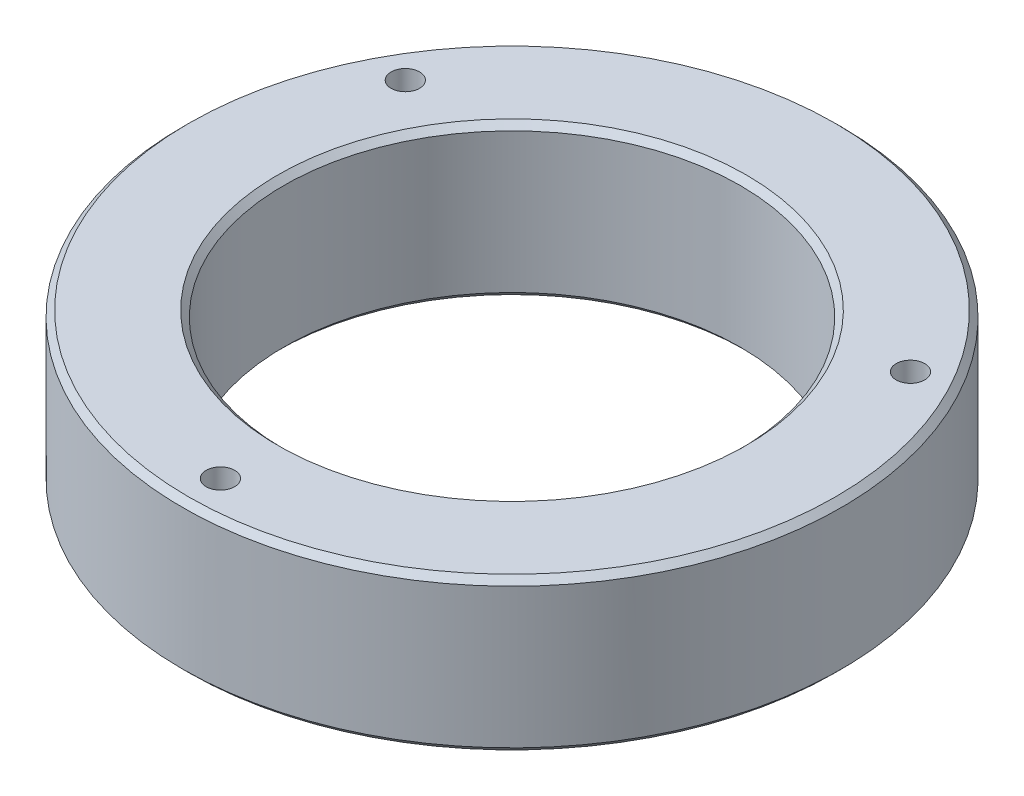
ISO-10303-21;
HEADER;
FILE_DESCRIPTION(('STEP AP214'),'2;1');
FILE_NAME('part.step','',(''),(''),'','','');
FILE_SCHEMA(('AUTOMOTIVE_DESIGN { 1 0 10303 214 1 1 1 1 }'));
ENDSEC;
DATA;
#1=APPLICATION_CONTEXT('core data for automotive mechanical design processes');
#2=APPLICATION_PROTOCOL_DEFINITION('international standard','automotive_design',2000,#1);
#3=PRODUCT_CONTEXT('',#1,'mechanical');
#4=PRODUCT('Part','Part','',(#3));
#5=PRODUCT_RELATED_PRODUCT_CATEGORY('part','',(#4));
#6=PRODUCT_DEFINITION_FORMATION('','',#4);
#7=PRODUCT_DEFINITION_CONTEXT('part definition',#1,'design');
#8=PRODUCT_DEFINITION('design','',#6,#7);
#9=PRODUCT_DEFINITION_SHAPE('','',#8);
#10=(LENGTH_UNIT() NAMED_UNIT(*) SI_UNIT(.MILLI.,.METRE.));
#11=(NAMED_UNIT(*) PLANE_ANGLE_UNIT() SI_UNIT($,.RADIAN.));
#12=(NAMED_UNIT(*) SI_UNIT($,.STERADIAN.) SOLID_ANGLE_UNIT());
#13=UNCERTAINTY_MEASURE_WITH_UNIT(LENGTH_MEASURE(1.E-05),#10,'distance_accuracy_value','');
#14=(GEOMETRIC_REPRESENTATION_CONTEXT(3) GLOBAL_UNCERTAINTY_ASSIGNED_CONTEXT((#13)) GLOBAL_UNIT_ASSIGNED_CONTEXT((#10,
#11,#12)) REPRESENTATION_CONTEXT('',''));
#15=CARTESIAN_POINT('',(0.,0.,0.));
#16=DIRECTION('',(0.,0.,1.));
#17=DIRECTION('',(1.,0.,0.));
#18=AXIS2_PLACEMENT_3D('',#15,#16,#17);
#19=CARTESIAN_POINT('',(-57.15,-19.05,0.));
#20=DIRECTION('',(0.,1.,0.));
#21=DIRECTION('',(0.,0.,1.));
#22=AXIS2_PLACEMENT_3D('',#19,#20,#21);
#23=PLANE('',#22);
#24=CARTESIAN_POINT('',(0.,-19.05,0.));
#25=DIRECTION('',(0.,1.,0.));
#26=DIRECTION('',(0.,0.,1.));
#27=AXIS2_PLACEMENT_3D('',#24,#25,#26);
#28=CIRCLE('',#27,58.674);
#29=CARTESIAN_POINT('',(0.,-19.05,-58.674));
#30=VERTEX_POINT('',#29);
#31=EDGE_CURVE('E55',#30,#30,#28,.T.);
#32=ORIENTED_EDGE('',*,*,#31,.T.);
#33=EDGE_LOOP('',(#32));
#34=FACE_BOUND('',#33,.T.);
#35=CARTESIAN_POINT('',(0.,-19.05,0.));
#36=DIRECTION('',(0.,1.,0.));
#37=DIRECTION('',(0.,0.,1.));
#38=AXIS2_PLACEMENT_3D('',#35,#36,#37);
#39=CIRCLE('',#38,81.0006);
#40=CARTESIAN_POINT('',(0.,-19.05,81.0006));
#41=VERTEX_POINT('',#40);
#42=EDGE_CURVE('E59',#41,#41,#39,.F.);
#43=ORIENTED_EDGE('',*,*,#42,.T.);
#44=EDGE_LOOP('',(#43));
#45=FACE_BOUND('',#44,.T.);
#46=CARTESIAN_POINT('',(69.85,-19.05,0.));
#47=DIRECTION('',(0.,1.,0.));
#48=DIRECTION('',(0.,0.,1.));
#49=AXIS2_PLACEMENT_3D('',#46,#47,#48);
#50=CIRCLE('',#49,3.96874999999999);
#51=CARTESIAN_POINT('',(69.85,-19.05,3.96874999999999));
#52=VERTEX_POINT('',#51);
#53=EDGE_CURVE('E119',#52,#52,#50,.T.);
#54=ORIENTED_EDGE('',*,*,#53,.T.);
#55=EDGE_LOOP('',(#54));
#56=FACE_BOUND('',#55,.T.);
#57=CARTESIAN_POINT('',(-69.85,-19.05,0.));
#58=DIRECTION('',(0.,1.,0.));
#59=DIRECTION('',(0.,0.,1.));
#60=AXIS2_PLACEMENT_3D('',#57,#58,#59);
#61=CIRCLE('',#60,3.96874999999999);
#62=CARTESIAN_POINT('',(-69.85,-19.05,3.96874999999999));
#63=VERTEX_POINT('',#62);
#64=EDGE_CURVE('E116',#63,#63,#61,.T.);
#65=ORIENTED_EDGE('',*,*,#64,.T.);
#66=EDGE_LOOP('',(#65));
#67=FACE_BOUND('',#66,.T.);
#68=CARTESIAN_POINT('',(0.,-19.05,73.025));
#69=DIRECTION('',(0.,-1.,0.));
#70=DIRECTION('',(0.,0.,-1.));
#71=AXIS2_PLACEMENT_3D('',#68,#69,#70);
#72=CIRCLE('',#71,5.56259999999999);
#73=CARTESIAN_POINT('',(0.,-19.05,67.4624));
#74=VERTEX_POINT('',#73);
#75=EDGE_CURVE('E109',#74,#74,#72,.T.);
#76=ORIENTED_EDGE('',*,*,#75,.F.);
#77=EDGE_LOOP('',(#76));
#78=FACE_BOUND('',#77,.T.);
#79=CARTESIAN_POINT('',(63.246,-19.05,-36.5252));
#80=DIRECTION('',(0.,-1.,0.));
#81=DIRECTION('',(0.,0.,-1.));
#82=AXIS2_PLACEMENT_3D('',#79,#80,#81);
#83=CIRCLE('',#82,5.5626);
#84=CARTESIAN_POINT('',(63.246,-19.05,-42.0878));
#85=VERTEX_POINT('',#84);
#86=EDGE_CURVE('E97',#85,#85,#83,.T.);
#87=ORIENTED_EDGE('',*,*,#86,.F.);
#88=EDGE_LOOP('',(#87));
#89=FACE_BOUND('',#88,.T.);
#90=CARTESIAN_POINT('',(-63.246,-19.05,-36.5252));
#91=DIRECTION('',(0.,-1.,0.));
#92=DIRECTION('',(0.,0.,-1.));
#93=AXIS2_PLACEMENT_3D('',#90,#91,#92);
#94=CIRCLE('',#93,5.56259999999999);
#95=CARTESIAN_POINT('',(-63.246,-19.05,-42.0878));
#96=VERTEX_POINT('',#95);
#97=EDGE_CURVE('E85',#96,#96,#94,.T.);
#98=ORIENTED_EDGE('',*,*,#97,.F.);
#99=EDGE_LOOP('',(#98));
#100=FACE_BOUND('',#99,.T.);
#101=ADVANCED_FACE('F43',(#34,#45,#56,#67,#78,#89,#100),#23,.F.);
#102=CARTESIAN_POINT('',(0.,-44.45,0.));
#103=DIRECTION('',(0.,-1.,0.));
#104=DIRECTION('',(0.,0.,-1.));
#105=AXIS2_PLACEMENT_3D('',#102,#103,#104);
#106=CYLINDRICAL_SURFACE('',#105,82.5246);
#107=CARTESIAN_POINT('',(0.,17.526,0.));
#108=DIRECTION('',(0.,-1.,0.));
#109=DIRECTION('',(0.,0.,-1.));
#110=AXIS2_PLACEMENT_3D('',#107,#108,#109);
#111=CIRCLE('',#110,82.5246);
#112=CARTESIAN_POINT('',(0.,17.526,-82.5246));
#113=VERTEX_POINT('',#112);
#114=EDGE_CURVE('E10',#113,#113,#111,.T.);
#115=ORIENTED_EDGE('',*,*,#114,.T.);
#116=EDGE_LOOP('',(#115));
#117=FACE_BOUND('',#116,.T.);
#118=CARTESIAN_POINT('',(0.,-17.526,0.));
#119=DIRECTION('',(0.,1.,0.));
#120=DIRECTION('',(0.,0.,1.));
#121=AXIS2_PLACEMENT_3D('',#118,#119,#120);
#122=CIRCLE('',#121,82.5246);
#123=CARTESIAN_POINT('',(0.,-17.526,82.5246));
#124=VERTEX_POINT('',#123);
#125=EDGE_CURVE('E51',#124,#124,#122,.T.);
#126=ORIENTED_EDGE('',*,*,#125,.T.);
#127=EDGE_LOOP('',(#126));
#128=FACE_BOUND('',#127,.T.);
#129=ADVANCED_FACE('F142',(#117,#128),#106,.T.);
#130=CARTESIAN_POINT('',(-82.5246,19.05,0.));
#131=DIRECTION('',(0.,-1.,0.));
#132=DIRECTION('',(0.,0.,-1.));
#133=AXIS2_PLACEMENT_3D('',#130,#131,#132);
#134=PLANE('',#133);
#135=CARTESIAN_POINT('',(0.,19.05,0.));
#136=DIRECTION('',(0.,-1.,0.));
#137=DIRECTION('',(0.,0.,-1.));
#138=AXIS2_PLACEMENT_3D('',#135,#136,#137);
#139=CIRCLE('',#138,58.674);
#140=CARTESIAN_POINT('',(0.,19.05,-58.674));
#141=VERTEX_POINT('',#140);
#142=EDGE_CURVE('E70',#141,#141,#139,.T.);
#143=ORIENTED_EDGE('',*,*,#142,.T.);
#144=EDGE_LOOP('',(#143));
#145=FACE_BOUND('',#144,.T.);
#146=CARTESIAN_POINT('',(0.,19.05,0.));
#147=DIRECTION('',(0.,-1.,0.));
#148=DIRECTION('',(0.,0.,-1.));
#149=AXIS2_PLACEMENT_3D('',#146,#147,#148);
#150=CIRCLE('',#149,81.0006);
#151=CARTESIAN_POINT('',(0.,19.05,-81.0006));
#152=VERTEX_POINT('',#151);
#153=EDGE_CURVE('E73',#152,#152,#150,.F.);
#154=ORIENTED_EDGE('',*,*,#153,.T.);
#155=EDGE_LOOP('',(#154));
#156=FACE_BOUND('',#155,.T.);
#157=CARTESIAN_POINT('',(0.,19.05,73.025));
#158=DIRECTION('',(0.,-1.,0.));
#159=DIRECTION('',(0.,0.,-1.));
#160=AXIS2_PLACEMENT_3D('',#157,#158,#159);
#161=CIRCLE('',#160,3.56869999999999);
#162=CARTESIAN_POINT('',(0.,19.05,69.4563));
#163=VERTEX_POINT('',#162);
#164=EDGE_CURVE('E100',#163,#163,#161,.T.);
#165=ORIENTED_EDGE('',*,*,#164,.T.);
#166=EDGE_LOOP('',(#165));
#167=FACE_BOUND('',#166,.T.);
#168=CARTESIAN_POINT('',(63.246,19.05,-36.5252));
#169=DIRECTION('',(0.,-1.,0.));
#170=DIRECTION('',(0.,0.,-1.));
#171=AXIS2_PLACEMENT_3D('',#168,#169,#170);
#172=CIRCLE('',#171,3.56869999999999);
#173=CARTESIAN_POINT('',(63.246,19.05,-40.0939));
#174=VERTEX_POINT('',#173);
#175=EDGE_CURVE('E88',#174,#174,#172,.T.);
#176=ORIENTED_EDGE('',*,*,#175,.T.);
#177=EDGE_LOOP('',(#176));
#178=FACE_BOUND('',#177,.T.);
#179=CARTESIAN_POINT('',(-63.246,19.05,-36.5252));
#180=DIRECTION('',(0.,-1.,0.));
#181=DIRECTION('',(0.,0.,-1.));
#182=AXIS2_PLACEMENT_3D('',#179,#180,#181);
#183=CIRCLE('',#182,3.56869999999999);
#184=CARTESIAN_POINT('',(-63.246,19.05,-40.0939));
#185=VERTEX_POINT('',#184);
#186=EDGE_CURVE('E76',#185,#185,#183,.T.);
#187=ORIENTED_EDGE('',*,*,#186,.T.);
#188=EDGE_LOOP('',(#187));
#189=FACE_BOUND('',#188,.T.);
#190=ADVANCED_FACE('F148',(#145,#156,#167,#178,#189),#134,.F.);
#191=CARTESIAN_POINT('',(0.,-44.45,0.));
#192=DIRECTION('',(0.,-1.,0.));
#193=DIRECTION('',(0.,0.,-1.));
#194=AXIS2_PLACEMENT_3D('',#191,#192,#193);
#195=CYLINDRICAL_SURFACE('',#194,57.15);
#196=CARTESIAN_POINT('',(0.,17.526,0.));
#197=DIRECTION('',(0.,-1.,0.));
#198=DIRECTION('',(0.,0.,-1.));
#199=AXIS2_PLACEMENT_3D('',#196,#197,#198);
#200=CIRCLE('',#199,57.15);
#201=CARTESIAN_POINT('',(0.,17.526,-57.15));
#202=VERTEX_POINT('',#201);
#203=EDGE_CURVE('E64',#202,#202,#200,.F.);
#204=CARTESIAN_POINT('',(0.,-17.526,0.));
#205=DIRECTION('',(0.,1.,0.));
#206=DIRECTION('',(0.,0.,1.));
#207=AXIS2_PLACEMENT_3D('',#204,#205,#206);
#208=CIRCLE('',#207,57.15);
#209=CARTESIAN_POINT('',(0.,-17.526,-57.15));
#210=VERTEX_POINT('',#209);
#211=EDGE_CURVE('E67',#210,#210,#208,.F.);
#212=CARTESIAN_POINT('',(0.,17.526,-57.15));
#213=CARTESIAN_POINT('',(0.,17.160875,-57.15));
#214=CARTESIAN_POINT('',(0.,16.79575,-57.15));
#215=CARTESIAN_POINT('',(0.,16.0655,-57.15));
#216=CARTESIAN_POINT('',(0.,15.700375,-57.15));
#217=CARTESIAN_POINT('',(0.,14.970125,-57.15));
#218=CARTESIAN_POINT('',(0.,14.605,-57.15));
#219=CARTESIAN_POINT('',(0.,13.87475,-57.15));
#220=CARTESIAN_POINT('',(0.,13.509625,-57.15));
#221=CARTESIAN_POINT('',(0.,12.779375,-57.15));
#222=CARTESIAN_POINT('',(0.,12.41425,-57.15));
#223=CARTESIAN_POINT('',(0.,11.684,-57.15));
#224=CARTESIAN_POINT('',(0.,11.318875,-57.15));
#225=CARTESIAN_POINT('',(0.,10.588625,-57.15));
#226=CARTESIAN_POINT('',(0.,10.2235,-57.15));
#227=CARTESIAN_POINT('',(0.,9.49324999999998,-57.15));
#228=CARTESIAN_POINT('',(0.,9.12812499999998,-57.15));
#229=CARTESIAN_POINT('',(0.,8.39787499999998,-57.15));
#230=CARTESIAN_POINT('',(0.,8.03274999999998,-57.15));
#231=CARTESIAN_POINT('',(0.,7.30249999999998,-57.15));
#232=CARTESIAN_POINT('',(0.,6.93737499999998,-57.15));
#233=CARTESIAN_POINT('',(0.,6.20712499999998,-57.15));
#234=CARTESIAN_POINT('',(0.,5.84199999999998,-57.15));
#235=CARTESIAN_POINT('',(0.,5.11174999999998,-57.15));
#236=CARTESIAN_POINT('',(0.,4.74662499999998,-57.15));
#237=CARTESIAN_POINT('',(0.,4.01637499999998,-57.15));
#238=CARTESIAN_POINT('',(0.,3.65124999999998,-57.15));
#239=CARTESIAN_POINT('',(0.,2.92099999999998,-57.15));
#240=CARTESIAN_POINT('',(0.,2.55587499999998,-57.15));
#241=CARTESIAN_POINT('',(0.,1.82562499999998,-57.15));
#242=CARTESIAN_POINT('',(0.,1.46049999999998,-57.15));
#243=CARTESIAN_POINT('',(0.,0.730249999999976,-57.15));
#244=CARTESIAN_POINT('',(0.,0.365124999999978,-57.15));
#245=CARTESIAN_POINT('',(0.,-0.365125000000019,-57.15));
#246=CARTESIAN_POINT('',(0.,-0.730250000000018,-57.15));
#247=CARTESIAN_POINT('',(0.,-1.46050000000002,-57.15));
#248=CARTESIAN_POINT('',(0.,-1.82562500000002,-57.15));
#249=CARTESIAN_POINT('',(0.,-2.55587500000002,-57.15));
#250=CARTESIAN_POINT('',(0.,-2.92100000000002,-57.15));
#251=CARTESIAN_POINT('',(0.,-3.65125000000002,-57.15));
#252=CARTESIAN_POINT('',(0.,-4.01637500000002,-57.15));
#253=CARTESIAN_POINT('',(0.,-4.74662500000002,-57.15));
#254=CARTESIAN_POINT('',(0.,-5.11175000000002,-57.15));
#255=CARTESIAN_POINT('',(0.,-5.84200000000002,-57.15));
#256=CARTESIAN_POINT('',(0.,-6.20712500000002,-57.15));
#257=CARTESIAN_POINT('',(0.,-6.93737500000002,-57.15));
#258=CARTESIAN_POINT('',(0.,-7.30250000000002,-57.15));
#259=CARTESIAN_POINT('',(0.,-8.03275000000002,-57.15));
#260=CARTESIAN_POINT('',(0.,-8.39787500000002,-57.15));
#261=CARTESIAN_POINT('',(0.,-9.12812500000002,-57.15));
#262=CARTESIAN_POINT('',(0.,-9.49325000000002,-57.15));
#263=CARTESIAN_POINT('',(0.,-10.2235,-57.15));
#264=CARTESIAN_POINT('',(0.,-10.588625,-57.15));
#265=CARTESIAN_POINT('',(0.,-11.318875,-57.15));
#266=CARTESIAN_POINT('',(0.,-11.684,-57.15));
#267=CARTESIAN_POINT('',(0.,-12.41425,-57.15));
#268=CARTESIAN_POINT('',(0.,-12.779375,-57.15));
#269=CARTESIAN_POINT('',(0.,-13.509625,-57.15));
#270=CARTESIAN_POINT('',(0.,-13.87475,-57.15));
#271=CARTESIAN_POINT('',(0.,-14.605,-57.15));
#272=CARTESIAN_POINT('',(0.,-14.970125,-57.15));
#273=CARTESIAN_POINT('',(0.,-15.700375,-57.15));
#274=CARTESIAN_POINT('',(0.,-16.0655,-57.15));
#275=CARTESIAN_POINT('',(0.,-16.79575,-57.15));
#276=CARTESIAN_POINT('',(0.,-17.160875,-57.15));
#277=CARTESIAN_POINT('',(0.,-17.526,-57.15));
#278=B_SPLINE_CURVE_WITH_KNOTS('',3,(#212,#213,#214,#215,#216,#217,#218,#219,#220,#221,#222,
#223,#224,#225,#226,#227,#228,#229,#230,#231,#232,#233,#234,#235,#236,#237,#238,#239,#240,#241,
#242,#243,#244,#245,#246,#247,#248,#249,#250,#251,#252,#253,#254,#255,#256,#257,#258,#259,#260,
#261,#262,#263,#264,#265,#266,#267,#268,#269,#270,#271,#272,#273,#274,#275,#276,#277),
.UNSPECIFIED.,.F.,.F.,(4,2,2,2,2,2,2,2,2,2,2,2,2,2,2,2,2,2,2,2,2,2,2,2,2,2,2,2,2,2,2,2,4),(0.,
1.095375,2.19075,3.286125,4.3815,5.476875,6.57225,7.667625,8.763,9.858375,10.95375,12.049125,
13.1445,14.239875,15.33525,16.430625,17.526,18.621375,19.71675,20.812125,21.9075,23.002875,
24.09825,25.193625,26.289,27.384375,28.47975,29.575125,30.6705,31.765875,32.86125,33.956625,
35.052),.UNSPECIFIED.);
#279=EDGE_CURVE('BSEAM176',#202,#210,#278,.T.);
#280=ORIENTED_EDGE('',*,*,#203,.T.);
#281=ORIENTED_EDGE('',*,*,#211,.T.);
#282=ORIENTED_EDGE('',*,*,#279,.T.);
#283=ORIENTED_EDGE('',*,*,#279,.F.);
#284=EDGE_LOOP('',(#280,#282,#281,#283));
#285=FACE_BOUND('',#284,.T.);
#286=ADVANCED_FACE('F176',(#285),#195,.F.);
#287=CARTESIAN_POINT('',(-63.246,-19.05,-36.5252));
#288=DIRECTION('',(0.,-1.,0.));
#289=DIRECTION('',(0.,0.,-1.));
#290=AXIS2_PLACEMENT_3D('',#287,#288,#289);
#291=CYLINDRICAL_SURFACE('',#290,3.56869999999999);
#292=ORIENTED_EDGE('',*,*,#186,.F.);
#293=EDGE_LOOP('',(#292));
#294=FACE_BOUND('',#293,.T.);
#295=CARTESIAN_POINT('',(-63.246,-9.39800000000001,-36.5252));
#296=DIRECTION('',(0.,-1.,0.));
#297=DIRECTION('',(0.,0.,-1.));
#298=AXIS2_PLACEMENT_3D('',#295,#296,#297);
#299=CIRCLE('',#298,3.56869999999999);
#300=CARTESIAN_POINT('',(-63.246,-9.39800000000001,-40.0939));
#301=VERTEX_POINT('',#300);
#302=EDGE_CURVE('E79',#301,#301,#299,.T.);
#303=ORIENTED_EDGE('',*,*,#302,.T.);
#304=EDGE_LOOP('',(#303));
#305=FACE_BOUND('',#304,.T.);
#306=ADVANCED_FACE('F184',(#294,#305),#291,.F.);
#307=CARTESIAN_POINT('',(-59.6773,-9.398,-36.5252));
#308=DIRECTION('',(0.,1.,0.));
#309=DIRECTION('',(0.,0.,1.));
#310=AXIS2_PLACEMENT_3D('',#307,#308,#309);
#311=PLANE('',#310);
#312=ORIENTED_EDGE('',*,*,#302,.F.);
#313=EDGE_LOOP('',(#312));
#314=FACE_BOUND('',#313,.T.);
#315=CARTESIAN_POINT('',(-63.246,-9.398,-36.5252));
#316=DIRECTION('',(0.,-1.,0.));
#317=DIRECTION('',(0.,0.,-1.));
#318=AXIS2_PLACEMENT_3D('',#315,#316,#317);
#319=CIRCLE('',#318,5.56259999999999);
#320=CARTESIAN_POINT('',(-63.246,-9.398,-42.0878));
#321=VERTEX_POINT('',#320);
#322=EDGE_CURVE('E82',#321,#321,#319,.T.);
#323=ORIENTED_EDGE('',*,*,#322,.T.);
#324=EDGE_LOOP('',(#323));
#325=FACE_BOUND('',#324,.T.);
#326=ADVANCED_FACE('F187',(#314,#325),#311,.F.);
#327=CARTESIAN_POINT('',(-63.246,-19.05,-36.5252));
#328=DIRECTION('',(0.,-1.,0.));
#329=DIRECTION('',(0.,0.,-1.));
#330=AXIS2_PLACEMENT_3D('',#327,#328,#329);
#331=CYLINDRICAL_SURFACE('',#330,5.56259999999999);
#332=ORIENTED_EDGE('',*,*,#322,.F.);
#333=EDGE_LOOP('',(#332));
#334=FACE_BOUND('',#333,.T.);
#335=ORIENTED_EDGE('',*,*,#97,.T.);
#336=EDGE_LOOP('',(#335));
#337=FACE_BOUND('',#336,.T.);
#338=ADVANCED_FACE('F193',(#334,#337),#331,.F.);
#339=CARTESIAN_POINT('',(63.246,-19.05,-36.5252));
#340=DIRECTION('',(0.,-1.,0.));
#341=DIRECTION('',(0.,0.,-1.));
#342=AXIS2_PLACEMENT_3D('',#339,#340,#341);
#343=CYLINDRICAL_SURFACE('',#342,3.56869999999999);
#344=ORIENTED_EDGE('',*,*,#175,.F.);
#345=EDGE_LOOP('',(#344));
#346=FACE_BOUND('',#345,.T.);
#347=CARTESIAN_POINT('',(63.246,-9.39800000000001,-36.5252));
#348=DIRECTION('',(0.,-1.,0.));
#349=DIRECTION('',(0.,0.,-1.));
#350=AXIS2_PLACEMENT_3D('',#347,#348,#349);
#351=CIRCLE('',#350,3.56869999999998);
#352=CARTESIAN_POINT('',(63.246,-9.39800000000001,-40.0939));
#353=VERTEX_POINT('',#352);
#354=EDGE_CURVE('E91',#353,#353,#351,.T.);
#355=ORIENTED_EDGE('',*,*,#354,.T.);
#356=EDGE_LOOP('',(#355));
#357=FACE_BOUND('',#356,.T.);
#358=ADVANCED_FACE('F199',(#346,#357),#343,.F.);
#359=CARTESIAN_POINT('',(66.8147,-9.398,-36.5252));
#360=DIRECTION('',(0.,1.,0.));
#361=DIRECTION('',(0.,0.,1.));
#362=AXIS2_PLACEMENT_3D('',#359,#360,#361);
#363=PLANE('',#362);
#364=ORIENTED_EDGE('',*,*,#354,.F.);
#365=EDGE_LOOP('',(#364));
#366=FACE_BOUND('',#365,.T.);
#367=CARTESIAN_POINT('',(63.246,-9.398,-36.5252));
#368=DIRECTION('',(0.,-1.,0.));
#369=DIRECTION('',(0.,0.,-1.));
#370=AXIS2_PLACEMENT_3D('',#367,#368,#369);
#371=CIRCLE('',#370,5.5626);
#372=CARTESIAN_POINT('',(63.246,-9.398,-42.0878));
#373=VERTEX_POINT('',#372);
#374=EDGE_CURVE('E94',#373,#373,#371,.T.);
#375=ORIENTED_EDGE('',*,*,#374,.T.);
#376=EDGE_LOOP('',(#375));
#377=FACE_BOUND('',#376,.T.);
#378=ADVANCED_FACE('F206',(#366,#377),#363,.F.);
#379=CARTESIAN_POINT('',(63.246,-19.05,-36.5252));
#380=DIRECTION('',(0.,-1.,0.));
#381=DIRECTION('',(0.,0.,-1.));
#382=AXIS2_PLACEMENT_3D('',#379,#380,#381);
#383=CYLINDRICAL_SURFACE('',#382,5.5626);
#384=ORIENTED_EDGE('',*,*,#374,.F.);
#385=EDGE_LOOP('',(#384));
#386=FACE_BOUND('',#385,.T.);
#387=ORIENTED_EDGE('',*,*,#86,.T.);
#388=EDGE_LOOP('',(#387));
#389=FACE_BOUND('',#388,.T.);
#390=ADVANCED_FACE('F299',(#386,#389),#383,.F.);
#391=CARTESIAN_POINT('',(0.,-19.05,73.025));
#392=DIRECTION('',(0.,-1.,0.));
#393=DIRECTION('',(0.,0.,-1.));
#394=AXIS2_PLACEMENT_3D('',#391,#392,#393);
#395=CYLINDRICAL_SURFACE('',#394,3.56869999999999);
#396=ORIENTED_EDGE('',*,*,#164,.F.);
#397=EDGE_LOOP('',(#396));
#398=FACE_BOUND('',#397,.T.);
#399=CARTESIAN_POINT('',(0.,-9.39800000000001,73.025));
#400=DIRECTION('',(0.,-1.,0.));
#401=DIRECTION('',(0.,0.,-1.));
#402=AXIS2_PLACEMENT_3D('',#399,#400,#401);
#403=CIRCLE('',#402,3.56869999999999);
#404=CARTESIAN_POINT('',(0.,-9.39800000000001,69.4563));
#405=VERTEX_POINT('',#404);
#406=EDGE_CURVE('E103',#405,#405,#403,.T.);
#407=ORIENTED_EDGE('',*,*,#406,.T.);
#408=EDGE_LOOP('',(#407));
#409=FACE_BOUND('',#408,.T.);
#410=ADVANCED_FACE('F290',(#398,#409),#395,.F.);
#411=CARTESIAN_POINT('',(3.56869999999999,-9.398,73.025));
#412=DIRECTION('',(0.,1.,0.));
#413=DIRECTION('',(0.,0.,1.));
#414=AXIS2_PLACEMENT_3D('',#411,#412,#413);
#415=PLANE('',#414);
#416=ORIENTED_EDGE('',*,*,#406,.F.);
#417=EDGE_LOOP('',(#416));
#418=FACE_BOUND('',#417,.T.);
#419=CARTESIAN_POINT('',(0.,-9.398,73.025));
#420=DIRECTION('',(0.,-1.,0.));
#421=DIRECTION('',(0.,0.,-1.));
#422=AXIS2_PLACEMENT_3D('',#419,#420,#421);
#423=CIRCLE('',#422,5.56259999999999);
#424=CARTESIAN_POINT('',(0.,-9.398,67.4624));
#425=VERTEX_POINT('',#424);
#426=EDGE_CURVE('E106',#425,#425,#423,.T.);
#427=ORIENTED_EDGE('',*,*,#426,.T.);
#428=EDGE_LOOP('',(#427));
#429=FACE_BOUND('',#428,.T.);
#430=ADVANCED_FACE('F281',(#418,#429),#415,.F.);
#431=CARTESIAN_POINT('',(0.,-19.05,73.025));
#432=DIRECTION('',(0.,-1.,0.));
#433=DIRECTION('',(0.,0.,-1.));
#434=AXIS2_PLACEMENT_3D('',#431,#432,#433);
#435=CYLINDRICAL_SURFACE('',#434,5.56259999999999);
#436=ORIENTED_EDGE('',*,*,#426,.F.);
#437=EDGE_LOOP('',(#436));
#438=FACE_BOUND('',#437,.T.);
#439=ORIENTED_EDGE('',*,*,#75,.T.);
#440=EDGE_LOOP('',(#439));
#441=FACE_BOUND('',#440,.T.);
#442=ADVANCED_FACE('F272',(#438,#441),#435,.F.);
#443=CARTESIAN_POINT('',(-69.85,6.35,0.));
#444=DIRECTION('',(0.,-1.,0.));
#445=DIRECTION('',(0.,0.,-1.));
#446=AXIS2_PLACEMENT_3D('',#443,#444,#445);
#447=CYLINDRICAL_SURFACE('',#446,3.96874999999999);
#448=CARTESIAN_POINT('',(-69.85,6.35,0.));
#449=DIRECTION('',(0.,1.,0.));
#450=DIRECTION('',(0.,0.,1.));
#451=AXIS2_PLACEMENT_3D('',#448,#449,#450);
#452=CIRCLE('',#451,3.96874999999999);
#453=CARTESIAN_POINT('',(-69.85,6.35,3.96874999999999));
#454=VERTEX_POINT('',#453);
#455=EDGE_CURVE('E113',#454,#454,#452,.T.);
#456=ORIENTED_EDGE('',*,*,#455,.T.);
#457=EDGE_LOOP('',(#456));
#458=FACE_BOUND('',#457,.T.);
#459=ORIENTED_EDGE('',*,*,#64,.F.);
#460=EDGE_LOOP('',(#459));
#461=FACE_BOUND('',#460,.T.);
#462=ADVANCED_FACE('F263',(#458,#461),#447,.F.);
#463=CARTESIAN_POINT('',(-69.85,6.35,0.));
#464=DIRECTION('',(0.,1.,0.));
#465=DIRECTION('',(0.,0.,1.));
#466=AXIS2_PLACEMENT_3D('',#463,#464,#465);
#467=PLANE('',#466);
#468=ORIENTED_EDGE('',*,*,#455,.F.);
#469=EDGE_LOOP('',(#468));
#470=FACE_BOUND('',#469,.T.);
#471=ADVANCED_FACE('F140',(#470),#467,.F.);
#472=CARTESIAN_POINT('',(69.85,6.35,0.));
#473=DIRECTION('',(0.,-1.,0.));
#474=DIRECTION('',(0.,0.,-1.));
#475=AXIS2_PLACEMENT_3D('',#472,#473,#474);
#476=CYLINDRICAL_SURFACE('',#475,3.96874999999999);
#477=CARTESIAN_POINT('',(69.85,6.35,0.));
#478=DIRECTION('',(0.,1.,0.));
#479=DIRECTION('',(0.,0.,1.));
#480=AXIS2_PLACEMENT_3D('',#477,#478,#479);
#481=CIRCLE('',#480,3.96874999999999);
#482=CARTESIAN_POINT('',(69.85,6.35,3.96874999999999));
#483=VERTEX_POINT('',#482);
#484=EDGE_CURVE('E112',#483,#483,#481,.T.);
#485=ORIENTED_EDGE('',*,*,#484,.T.);
#486=EDGE_LOOP('',(#485));
#487=FACE_BOUND('',#486,.T.);
#488=ORIENTED_EDGE('',*,*,#53,.F.);
#489=EDGE_LOOP('',(#488));
#490=FACE_BOUND('',#489,.T.);
#491=ADVANCED_FACE('F125',(#487,#490),#476,.F.);
#492=CARTESIAN_POINT('',(69.85,6.35,0.));
#493=DIRECTION('',(0.,1.,0.));
#494=DIRECTION('',(0.,0.,1.));
#495=AXIS2_PLACEMENT_3D('',#492,#493,#494);
#496=PLANE('',#495);
#497=ORIENTED_EDGE('',*,*,#484,.F.);
#498=EDGE_LOOP('',(#497));
#499=FACE_BOUND('',#498,.T.);
#500=ADVANCED_FACE('F128',(#499),#496,.F.);
#501=CARTESIAN_POINT('',(0.,19.05,0.));
#502=DIRECTION('',(0.,1.,0.));
#503=DIRECTION('',(0.,0.,1.));
#504=AXIS2_PLACEMENT_3D('',#501,#502,#503);
#505=CONICAL_SURFACE('',#504,58.674,0.785398163397435);
#506=ORIENTED_EDGE('',*,*,#203,.F.);
#507=EDGE_LOOP('',(#506));
#508=FACE_BOUND('',#507,.T.);
#509=ORIENTED_EDGE('',*,*,#142,.F.);
#510=EDGE_LOOP('',(#509));
#511=FACE_BOUND('',#510,.T.);
#512=ADVANCED_FACE('F130',(#508,#511),#505,.F.);
#513=CARTESIAN_POINT('',(0.,-17.526,0.));
#514=DIRECTION('',(0.,-1.,0.));
#515=DIRECTION('',(0.,0.,-1.));
#516=AXIS2_PLACEMENT_3D('',#513,#514,#515);
#517=CONICAL_SURFACE('',#516,57.15,0.785398163397451);
#518=CARTESIAN_POINT('',(0.,-19.05,-58.674));
#519=CARTESIAN_POINT('',(0.,-19.034125,-58.658125));
#520=CARTESIAN_POINT('',(0.,-19.01825,-58.64225));
#521=CARTESIAN_POINT('',(0.,-18.9865,-58.6105));
#522=CARTESIAN_POINT('',(0.,-18.970625,-58.594625));
#523=CARTESIAN_POINT('',(0.,-18.938875,-58.562875));
#524=CARTESIAN_POINT('',(0.,-18.923,-58.547));
#525=CARTESIAN_POINT('',(0.,-18.89125,-58.51525));
#526=CARTESIAN_POINT('',(0.,-18.875375,-58.499375));
#527=CARTESIAN_POINT('',(0.,-18.843625,-58.467625));
#528=CARTESIAN_POINT('',(0.,-18.82775,-58.45175));
#529=CARTESIAN_POINT('',(0.,-18.796,-58.42));
#530=CARTESIAN_POINT('',(0.,-18.780125,-58.404125));
#531=CARTESIAN_POINT('',(0.,-18.748375,-58.372375));
#532=CARTESIAN_POINT('',(0.,-18.7325,-58.3565));
#533=CARTESIAN_POINT('',(0.,-18.70075,-58.32475));
#534=CARTESIAN_POINT('',(0.,-18.684875,-58.308875));
#535=CARTESIAN_POINT('',(0.,-18.653125,-58.277125));
#536=CARTESIAN_POINT('',(0.,-18.63725,-58.26125));
#537=CARTESIAN_POINT('',(0.,-18.6055,-58.2295));
#538=CARTESIAN_POINT('',(0.,-18.589625,-58.213625));
#539=CARTESIAN_POINT('',(0.,-18.557875,-58.181875));
#540=CARTESIAN_POINT('',(0.,-18.542,-58.166));
#541=CARTESIAN_POINT('',(0.,-18.51025,-58.13425));
#542=CARTESIAN_POINT('',(0.,-18.494375,-58.118375));
#543=CARTESIAN_POINT('',(0.,-18.462625,-58.086625));
#544=CARTESIAN_POINT('',(0.,-18.44675,-58.07075));
#545=CARTESIAN_POINT('',(0.,-18.415,-58.039));
#546=CARTESIAN_POINT('',(0.,-18.399125,-58.023125));
#547=CARTESIAN_POINT('',(0.,-18.367375,-57.991375));
#548=CARTESIAN_POINT('',(0.,-18.3515,-57.9755));
#549=CARTESIAN_POINT('',(0.,-18.31975,-57.94375));
#550=CARTESIAN_POINT('',(0.,-18.303875,-57.927875));
#551=CARTESIAN_POINT('',(0.,-18.272125,-57.896125));
#552=CARTESIAN_POINT('',(0.,-18.25625,-57.88025));
#553=CARTESIAN_POINT('',(0.,-18.2245,-57.8485));
#554=CARTESIAN_POINT('',(0.,-18.208625,-57.832625));
#555=CARTESIAN_POINT('',(0.,-18.176875,-57.800875));
#556=CARTESIAN_POINT('',(0.,-18.161,-57.785));
#557=CARTESIAN_POINT('',(0.,-18.12925,-57.75325));
#558=CARTESIAN_POINT('',(0.,-18.113375,-57.737375));
#559=CARTESIAN_POINT('',(0.,-18.081625,-57.705625));
#560=CARTESIAN_POINT('',(0.,-18.06575,-57.68975));
#561=CARTESIAN_POINT('',(0.,-18.034,-57.658));
#562=CARTESIAN_POINT('',(0.,-18.018125,-57.642125));
#563=CARTESIAN_POINT('',(0.,-17.986375,-57.610375));
#564=CARTESIAN_POINT('',(0.,-17.9705,-57.5945));
#565=CARTESIAN_POINT('',(0.,-17.93875,-57.56275));
#566=CARTESIAN_POINT('',(0.,-17.922875,-57.546875));
#567=CARTESIAN_POINT('',(0.,-17.891125,-57.515125));
#568=CARTESIAN_POINT('',(0.,-17.87525,-57.49925));
#569=CARTESIAN_POINT('',(0.,-17.8435,-57.4675));
#570=CARTESIAN_POINT('',(0.,-17.827625,-57.451625));
#571=CARTESIAN_POINT('',(0.,-17.795875,-57.419875));
#572=CARTESIAN_POINT('',(0.,-17.78,-57.404));
#573=CARTESIAN_POINT('',(0.,-17.74825,-57.37225));
#574=CARTESIAN_POINT('',(0.,-17.732375,-57.356375));
#575=CARTESIAN_POINT('',(0.,-17.700625,-57.324625));
#576=CARTESIAN_POINT('',(0.,-17.68475,-57.30875));
#577=CARTESIAN_POINT('',(0.,-17.653,-57.277));
#578=CARTESIAN_POINT('',(0.,-17.637125,-57.261125));
#579=CARTESIAN_POINT('',(0.,-17.605375,-57.229375));
#580=CARTESIAN_POINT('',(0.,-17.5895,-57.2135));
#581=CARTESIAN_POINT('',(0.,-17.55775,-57.18175));
#582=CARTESIAN_POINT('',(0.,-17.541875,-57.165875));
#583=CARTESIAN_POINT('',(0.,-17.526,-57.15));
#584=B_SPLINE_CURVE_WITH_KNOTS('',3,(#518,#519,#520,#521,#522,#523,#524,#525,#526,#527,#528,
#529,#530,#531,#532,#533,#534,#535,#536,#537,#538,#539,#540,#541,#542,#543,#544,#545,#546,#547,
#548,#549,#550,#551,#552,#553,#554,#555,#556,#557,#558,#559,#560,#561,#562,#563,#564,#565,#566,
#567,#568,#569,#570,#571,#572,#573,#574,#575,#576,#577,#578,#579,#580,#581,#582,#583),
.UNSPECIFIED.,.F.,.F.,(4,2,2,2,2,2,2,2,2,2,2,2,2,2,2,2,2,2,2,2,2,2,2,2,2,2,2,2,2,2,2,2,4),(0.,
0.0673519209080149,0.134703841816037,0.202055762724052,0.269407683632072,0.336759604540087,
0.404111525448106,0.471463446356126,0.538815367264141,0.606167288172161,0.673519209080176,
0.740871129988195,0.80822305089621,0.87557497180423,0.94292689271225,1.01027881362026,
1.07763073452828,1.1449826554363,1.21233457634432,1.27968649725234,1.34703841816036,
1.41439033906838,1.48174225997639,1.54909418088441,1.61644610179242,1.68379802270044,
1.75114994360846,1.81850186451648,1.88585378542449,1.95320570633251,2.02055762724053,
2.08790954814855,2.15526146905657),.UNSPECIFIED.);
#585=EDGE_CURVE('BSEAM137',#30,#210,#584,.T.);
#586=ORIENTED_EDGE('',*,*,#31,.F.);
#587=ORIENTED_EDGE('',*,*,#211,.F.);
#588=ORIENTED_EDGE('',*,*,#585,.T.);
#589=ORIENTED_EDGE('',*,*,#585,.F.);
#590=EDGE_LOOP('',(#586,#588,#587,#589));
#591=FACE_BOUND('',#590,.T.);
#592=ADVANCED_FACE('F137',(#591),#517,.F.);
#593=CARTESIAN_POINT('',(0.,17.526,0.));
#594=DIRECTION('',(0.,-1.,0.));
#595=DIRECTION('',(0.,0.,-1.));
#596=AXIS2_PLACEMENT_3D('',#593,#594,#595);
#597=CONICAL_SURFACE('',#596,82.5246,0.785398163397451);
#598=ORIENTED_EDGE('',*,*,#153,.F.);
#599=EDGE_LOOP('',(#598));
#600=FACE_BOUND('',#599,.T.);
#601=ORIENTED_EDGE('',*,*,#114,.F.);
#602=EDGE_LOOP('',(#601));
#603=FACE_BOUND('',#602,.T.);
#604=ADVANCED_FACE('F161',(#600,#603),#597,.T.);
#605=CARTESIAN_POINT('',(0.,-19.05,0.));
#606=DIRECTION('',(0.,1.,0.));
#607=DIRECTION('',(0.,0.,1.));
#608=AXIS2_PLACEMENT_3D('',#605,#606,#607);
#609=CONICAL_SURFACE('',#608,81.0006,0.785398163397448);
#610=ORIENTED_EDGE('',*,*,#125,.F.);
#611=EDGE_LOOP('',(#610));
#612=FACE_BOUND('',#611,.T.);
#613=ORIENTED_EDGE('',*,*,#42,.F.);
#614=EDGE_LOOP('',(#613));
#615=FACE_BOUND('',#614,.T.);
#616=ADVANCED_FACE('F46',(#612,#615),#609,.T.);
#617=CLOSED_SHELL('',(#101,#129,#190,#286,#306,#326,#338,#358,#378,#390,#410,#430,#442,#462,
#471,#491,#500,#512,#592,#604,#616));
#618=MANIFOLD_SOLID_BREP('B2',#617);
#619=ADVANCED_BREP_SHAPE_REPRESENTATION('',(#18,#618),#14);
#620=SHAPE_DEFINITION_REPRESENTATION(#9,#619);
ENDSEC;
END-ISO-10303-21;
